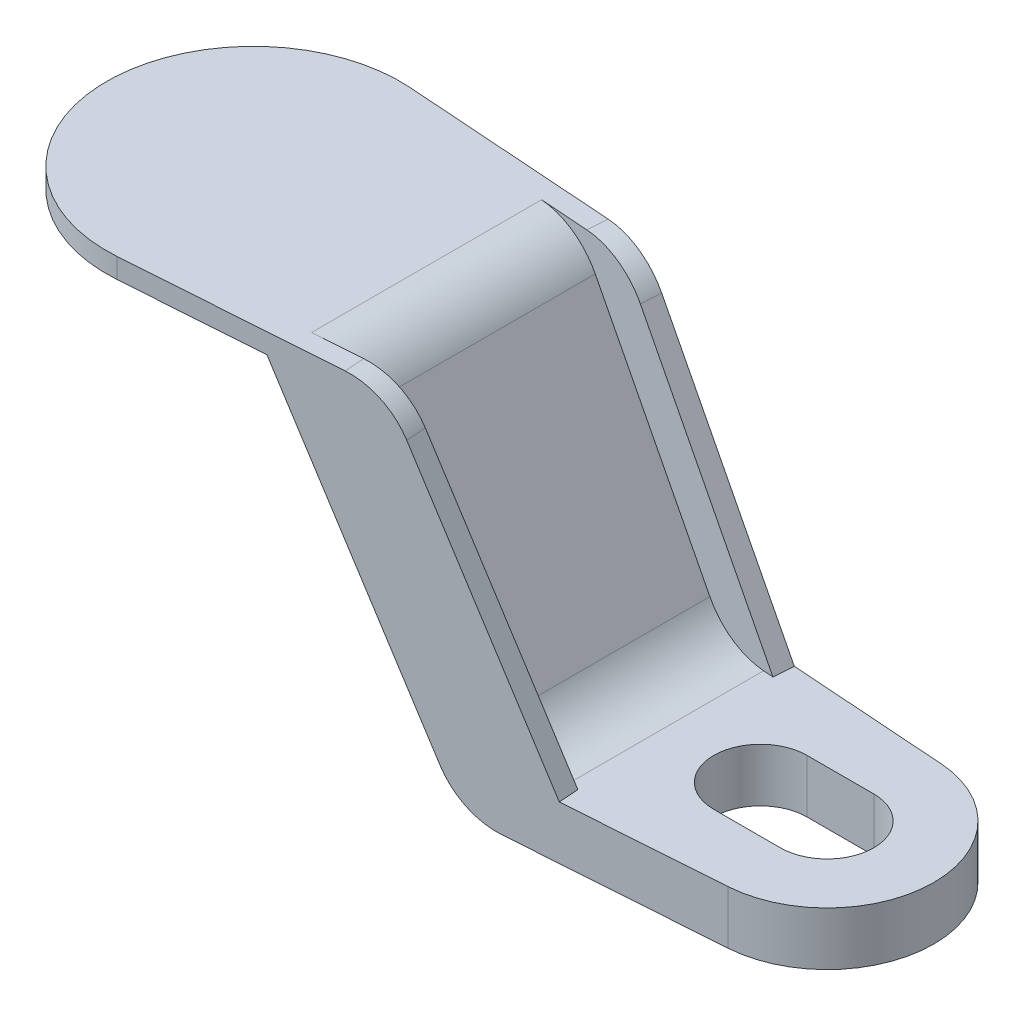
ISO-10303-21;
HEADER;
FILE_DESCRIPTION(('STEP AP214'),'2;1');
FILE_NAME('part.step','',(''),(''),'','','');
FILE_SCHEMA(('AUTOMOTIVE_DESIGN { 1 0 10303 214 1 1 1 1 }'));
ENDSEC;
DATA;
#1=APPLICATION_CONTEXT('core data for automotive mechanical design processes');
#2=APPLICATION_PROTOCOL_DEFINITION('international standard','automotive_design',2000,#1);
#3=PRODUCT_CONTEXT('',#1,'mechanical');
#4=PRODUCT('Part','Part','',(#3));
#5=PRODUCT_RELATED_PRODUCT_CATEGORY('part','',(#4));
#6=PRODUCT_DEFINITION_FORMATION('','',#4);
#7=PRODUCT_DEFINITION_CONTEXT('part definition',#1,'design');
#8=PRODUCT_DEFINITION('design','',#6,#7);
#9=PRODUCT_DEFINITION_SHAPE('','',#8);
#10=(LENGTH_UNIT() NAMED_UNIT(*) SI_UNIT(.MILLI.,.METRE.));
#11=(NAMED_UNIT(*) PLANE_ANGLE_UNIT() SI_UNIT($,.RADIAN.));
#12=(NAMED_UNIT(*) SI_UNIT($,.STERADIAN.) SOLID_ANGLE_UNIT());
#13=UNCERTAINTY_MEASURE_WITH_UNIT(LENGTH_MEASURE(1.E-05),#10,'distance_accuracy_value','');
#14=(GEOMETRIC_REPRESENTATION_CONTEXT(3) GLOBAL_UNCERTAINTY_ASSIGNED_CONTEXT((#13)) GLOBAL_UNIT_ASSIGNED_CONTEXT((#10,
#11,#12)) REPRESENTATION_CONTEXT('',''));
#15=CARTESIAN_POINT('',(0.,0.,0.));
#16=DIRECTION('',(0.,0.,1.));
#17=DIRECTION('',(1.,0.,0.));
#18=AXIS2_PLACEMENT_3D('',#15,#16,#17);
#19=CARTESIAN_POINT('',(28.5677313259564,0.,-11.));
#20=DIRECTION('',(0.866025403784436,0.500000000000004,0.));
#21=DIRECTION('',(-0.500000000000004,0.866025403784436,0.));
#22=AXIS2_PLACEMENT_3D('',#19,#20,#21);
#23=PLANE('',#22);
#24=DIRECTION('',(-0.4996945735623,0.865496389676358,-0.0349475694373828));
#25=VECTOR('',#24,1.);
#26=CARTESIAN_POINT('',(28.5070511955666,0.105101068845031,-7.52948318100781));
#27=LINE('',#26,#25);
#28=CARTESIAN_POINT('',(27.1243556529823,2.49999999999998,-7.62618594914223));
#29=VERTEX_POINT('',#28);
#30=CARTESIAN_POINT('',(16.4433756729741,21.,-8.37319083824795));
#31=VERTEX_POINT('',#30);
#32=EDGE_CURVE('E229',#29,#31,#27,.T.);
#33=ORIENTED_EDGE('',*,*,#32,.F.);
#34=DIRECTION('',(0.,0.,1.));
#35=VECTOR('',#34,1.);
#36=CARTESIAN_POINT('',(27.1243556529823,2.49999999999998,-11.));
#37=LINE('',#36,#35);
#38=CARTESIAN_POINT('',(27.1243556529823,2.49999999999998,7.62618594914224));
#39=VERTEX_POINT('',#38);
#40=EDGE_CURVE('E248',#29,#39,#37,.T.);
#41=ORIENTED_EDGE('',*,*,#40,.T.);
#42=DIRECTION('',(0.4996945735623,-0.865496389676358,-0.0349475694373828));
#43=VECTOR('',#42,1.);
#44=CARTESIAN_POINT('',(28.8912396333217,-0.56033282502738,7.50261386359704));
#45=LINE('',#44,#43);
#46=CARTESIAN_POINT('',(16.4433756729741,21.,8.37319083824795));
#47=VERTEX_POINT('',#46);
#48=EDGE_CURVE('E376',#47,#39,#45,.T.);
#49=ORIENTED_EDGE('',*,*,#48,.F.);
#50=DIRECTION('',(0.,0.,1.));
#51=VECTOR('',#50,1.);
#52=CARTESIAN_POINT('',(16.4433756729741,21.,-8.47413744488385));
#53=LINE('',#52,#51);
#54=EDGE_CURVE('E245',#47,#31,#53,.F.);
#55=ORIENTED_EDGE('',*,*,#54,.T.);
#56=EDGE_LOOP('',(#33,#41,#49,#55));
#57=FACE_BOUND('',#56,.T.);
#58=ADVANCED_FACE('F33',(#57),#23,.F.);
#59=CARTESIAN_POINT('',(15.8660254037844,25.,-11.));
#60=DIRECTION('',(-0.866025403784436,-0.500000000000004,0.));
#61=DIRECTION('',(0.500000000000004,-0.866025403784436,0.));
#62=AXIS2_PLACEMENT_3D('',#59,#60,#61);
#63=PLANE('',#62);
#64=DIRECTION('',(-0.4996945735623,0.865496389676358,0.0349475694373828));
#65=VECTOR('',#64,1.);
#66=CARTESIAN_POINT('',(16.2050467187898,24.4127978575618,8.38985905542693));
#67=LINE('',#66,#65);
#68=CARTESIAN_POINT('',(26.5470053837926,6.49999999999998,7.6665645917966));
#69=VERTEX_POINT('',#68);
#70=CARTESIAN_POINT('',(17.3094010767585,22.5,8.31262287426641));
#71=VERTEX_POINT('',#70);
#72=EDGE_CURVE('E325',#69,#71,#67,.T.);
#73=ORIENTED_EDGE('',*,*,#72,.F.);
#74=DIRECTION('',(0.,0.,1.));
#75=VECTOR('',#74,1.);
#76=CARTESIAN_POINT('',(26.5470053837926,6.49999999999998,-7.56561798516069));
#77=LINE('',#76,#75);
#78=CARTESIAN_POINT('',(26.5470053837926,6.49999999999998,-7.6665645917966));
#79=VERTEX_POINT('',#78);
#80=EDGE_CURVE('E296',#69,#79,#77,.F.);
#81=ORIENTED_EDGE('',*,*,#80,.T.);
#82=DIRECTION('',(0.4996945735623,-0.865496389676358,0.0349475694373828));
#83=VECTOR('',#82,1.);
#84=CARTESIAN_POINT('',(15.8208582810347,25.0782317514343,-8.4167283728377));
#85=LINE('',#84,#83);
#86=CARTESIAN_POINT('',(17.3094010767585,22.5,-8.3126228742664));
#87=VERTEX_POINT('',#86);
#88=EDGE_CURVE('E230',#87,#79,#85,.T.);
#89=ORIENTED_EDGE('',*,*,#88,.F.);
#90=DIRECTION('',(0.,0.,1.));
#91=VECTOR('',#90,1.);
#92=CARTESIAN_POINT('',(17.3094010767585,22.5,8.41356948090231));
#93=LINE('',#92,#91);
#94=EDGE_CURVE('E293',#87,#71,#93,.T.);
#95=ORIENTED_EDGE('',*,*,#94,.T.);
#96=EDGE_LOOP('',(#73,#81,#89,#95));
#97=FACE_BOUND('',#96,.T.);
#98=ADVANCED_FACE('F522',(#97),#63,.F.);
#99=CARTESIAN_POINT('',(-11.,23.5,-11.));
#100=DIRECTION('',(0.,1.,0.));
#101=DIRECTION('',(0.,0.,1.));
#102=AXIS2_PLACEMENT_3D('',#99,#100,#101);
#103=PLANE('',#102);
#104=DIRECTION('',(-0.997563283233824,0.,-0.069767441860465));
#105=VECTOR('',#104,1.);
#106=CARTESIAN_POINT('',(-11.0492386689609,23.5,-10.2959654681193));
#107=LINE('',#106,#105);
#108=CARTESIAN_POINT('',(12.1132486540519,23.5,-8.67603065815566));
#109=VERTEX_POINT('',#108);
#110=CARTESIAN_POINT('',(11.1510105462042,23.5,-8.74332753282367));
#111=VERTEX_POINT('',#110);
#112=EDGE_CURVE('E217',#109,#111,#107,.T.);
#113=ORIENTED_EDGE('',*,*,#112,.F.);
#114=DIRECTION('',(0.,0.,1.));
#115=VECTOR('',#114,1.);
#116=CARTESIAN_POINT('',(12.1132486540519,23.5,8.47413744488385));
#117=LINE('',#116,#115);
#118=CARTESIAN_POINT('',(12.1132486540519,23.5,8.67603065815567));
#119=VERTEX_POINT('',#118);
#120=EDGE_CURVE('E265',#109,#119,#117,.T.);
#121=ORIENTED_EDGE('',*,*,#120,.T.);
#122=DIRECTION('',(0.997563283233824,0.,-0.069767441860465));
#123=VECTOR('',#122,1.);
#124=CARTESIAN_POINT('',(-9.51809502492764,23.5,10.1888805573567));
#125=LINE('',#124,#123);
#126=CARTESIAN_POINT('',(11.1510105462042,23.5,8.74332753282367));
#127=VERTEX_POINT('',#126);
#128=EDGE_CURVE('E379',#127,#119,#125,.T.);
#129=ORIENTED_EDGE('',*,*,#128,.F.);
#130=DIRECTION('',(0.0697674418604651,0.,0.997563283233824));
#131=VECTOR('',#130,1.);
#132=CARTESIAN_POINT('',(9.66910557113185,23.5,-12.445553024533));
#133=LINE('',#132,#131);
#134=CARTESIAN_POINT('',(11.2556617089949,23.5,10.2396724576744));
#135=VERTEX_POINT('',#134);
#136=EDGE_CURVE('E454',#127,#135,#133,.T.);
#137=ORIENTED_EDGE('',*,*,#136,.T.);
#138=DIRECTION('',(0.997563283233824,0.,-0.0697674418604651));
#139=VECTOR('',#138,1.);
#140=CARTESIAN_POINT('',(0.767441860465116,23.5,10.9731961155721));
#141=LINE('',#140,#139);
#142=CARTESIAN_POINT('',(0.767441860465116,23.5,10.9731961155721));
#143=VERTEX_POINT('',#142);
#144=EDGE_CURVE('E399',#143,#135,#141,.T.);
#145=ORIENTED_EDGE('',*,*,#144,.F.);
#146=CARTESIAN_POINT('',(0.,23.5,0.));
#147=DIRECTION('',(0.,1.,0.));
#148=DIRECTION('',(0.,0.,1.));
#149=AXIS2_PLACEMENT_3D('',#146,#147,#148);
#150=CIRCLE('',#149,11.);
#151=CARTESIAN_POINT('',(0.767441860465116,23.5,-10.9731961155721));
#152=VERTEX_POINT('',#151);
#153=EDGE_CURVE('E396',#152,#143,#150,.T.);
#154=ORIENTED_EDGE('',*,*,#153,.F.);
#155=DIRECTION('',(-0.997563283233824,0.,-0.0697674418604651));
#156=VECTOR('',#155,1.);
#157=CARTESIAN_POINT('',(0.767441860465116,23.5,-10.9731961155721));
#158=LINE('',#157,#156);
#159=CARTESIAN_POINT('',(11.2556617089949,23.5,-10.2396724576744));
#160=VERTEX_POINT('',#159);
#161=EDGE_CURVE('E244',#160,#152,#158,.T.);
#162=ORIENTED_EDGE('',*,*,#161,.F.);
#163=DIRECTION('',(0.0697674418604651,0.,-0.997563283233824));
#164=VECTOR('',#163,1.);
#165=CARTESIAN_POINT('',(11.2002492151652,23.5,-9.44736206470439));
#166=LINE('',#165,#164);
#167=EDGE_CURVE('E236',#111,#160,#166,.T.);
#168=ORIENTED_EDGE('',*,*,#167,.F.);
#169=EDGE_LOOP('',(#113,#121,#129,#137,#145,#154,#162,#168));
#170=FACE_BOUND('',#169,.T.);
#171=ADVANCED_FACE('F242',(#170),#103,.F.);
#172=CARTESIAN_POINT('',(51.,4.,-11.));
#173=DIRECTION('',(0.,-1.,0.));
#174=DIRECTION('',(1.,0.,0.));
#175=AXIS2_PLACEMENT_3D('',#172,#173,#174);
#176=PLANE('',#175);
#177=CARTESIAN_POINT('',(43.,4.,0.));
#178=DIRECTION('',(0.,-1.,0.));
#179=DIRECTION('',(1.,0.,0.));
#180=AXIS2_PLACEMENT_3D('',#177,#178,#179);
#181=CIRCLE('',#180,3.5);
#182=CARTESIAN_POINT('',(43.,4.,-3.5));
#183=VERTEX_POINT('',#182);
#184=CARTESIAN_POINT('',(43.,4.,3.5));
#185=VERTEX_POINT('',#184);
#186=EDGE_CURVE('E386',#183,#185,#181,.T.);
#187=ORIENTED_EDGE('',*,*,#186,.T.);
#188=DIRECTION('',(-1.,0.,0.));
#189=VECTOR('',#188,1.);
#190=CARTESIAN_POINT('',(43.,4.,3.5));
#191=LINE('',#190,#189);
#192=CARTESIAN_POINT('',(38.,4.,3.5));
#193=VERTEX_POINT('',#192);
#194=EDGE_CURVE('E447',#185,#193,#191,.T.);
#195=ORIENTED_EDGE('',*,*,#194,.T.);
#196=CARTESIAN_POINT('',(38.,4.,0.));
#197=DIRECTION('',(0.,-1.,0.));
#198=DIRECTION('',(1.,0.,0.));
#199=AXIS2_PLACEMENT_3D('',#196,#197,#198);
#200=CIRCLE('',#199,3.5);
#201=CARTESIAN_POINT('',(38.,4.,-3.5));
#202=VERTEX_POINT('',#201);
#203=EDGE_CURVE('E382',#193,#202,#200,.T.);
#204=ORIENTED_EDGE('',*,*,#203,.T.);
#205=DIRECTION('',(1.,0.,0.));
#206=VECTOR('',#205,1.);
#207=CARTESIAN_POINT('',(43.,4.,-3.5));
#208=LINE('',#207,#206);
#209=EDGE_CURVE('E384',#202,#183,#208,.T.);
#210=ORIENTED_EDGE('',*,*,#209,.T.);
#211=EDGE_LOOP('',(#187,#195,#204,#210));
#212=FACE_BOUND('',#211,.T.);
#213=DIRECTION('',(0.997563283233824,0.,0.069767441860465));
#214=VECTOR('',#213,1.);
#215=CARTESIAN_POINT('',(50.6489765825263,4.,-5.98092428947994));
#216=LINE('',#215,#214);
#217=CARTESIAN_POINT('',(30.8771324027148,4.,-7.36372477188888));
#218=VERTEX_POINT('',#217);
#219=CARTESIAN_POINT('',(31.6300681849811,4.,-7.31106605409442));
#220=VERTEX_POINT('',#219);
#221=EDGE_CURVE('E251',#218,#220,#216,.T.);
#222=ORIENTED_EDGE('',*,*,#221,.F.);
#223=DIRECTION('',(0.,0.,1.));
#224=VECTOR('',#223,1.);
#225=CARTESIAN_POINT('',(30.8771324027148,4.,7.56561798516069));
#226=LINE('',#225,#224);
#227=CARTESIAN_POINT('',(30.8771324027148,4.,7.36372477188888));
#228=VERTEX_POINT('',#227);
#229=EDGE_CURVE('E286',#218,#228,#226,.T.);
#230=ORIENTED_EDGE('',*,*,#229,.T.);
#231=DIRECTION('',(-0.997563283233824,0.,0.069767441860465));
#232=VECTOR('',#231,1.);
#233=CARTESIAN_POINT('',(52.1801202265597,4.,5.87383937871737));
#234=LINE('',#233,#232);
#235=CARTESIAN_POINT('',(31.6300681849811,4.,7.31106605409442));
#236=VERTEX_POINT('',#235);
#237=EDGE_CURVE('E449',#236,#228,#234,.T.);
#238=ORIENTED_EDGE('',*,*,#237,.F.);
#239=DIRECTION('',(0.0697674418604651,0.,0.997563283233824));
#240=VECTOR('',#239,1.);
#241=CARTESIAN_POINT('',(30.4499479584214,4.,-9.56277332462295));
#242=LINE('',#241,#240);
#243=CARTESIAN_POINT('',(31.7347193477718,4.,8.80741097894516));
#244=VERTEX_POINT('',#243);
#245=EDGE_CURVE('E451',#236,#244,#242,.T.);
#246=ORIENTED_EDGE('',*,*,#245,.T.);
#247=DIRECTION('',(-0.997563283233824,0.,0.0697674418604651));
#248=VECTOR('',#247,1.);
#249=CARTESIAN_POINT('',(0.767441860465119,3.99999999999999,10.9731961155721));
#250=LINE('',#249,#248);
#251=CARTESIAN_POINT('',(43.5581395348837,4.,7.98050626587059));
#252=VERTEX_POINT('',#251);
#253=EDGE_CURVE('E393',#252,#244,#250,.T.);
#254=ORIENTED_EDGE('',*,*,#253,.F.);
#255=CARTESIAN_POINT('',(43.,4.,0.));
#256=DIRECTION('',(0.,-1.,0.));
#257=DIRECTION('',(1.,0.,0.));
#258=AXIS2_PLACEMENT_3D('',#255,#256,#257);
#259=CIRCLE('',#258,8.);
#260=CARTESIAN_POINT('',(43.5581395348837,4.,-7.98050626587059));
#261=VERTEX_POINT('',#260);
#262=EDGE_CURVE('E390',#261,#252,#259,.T.);
#263=ORIENTED_EDGE('',*,*,#262,.F.);
#264=DIRECTION('',(0.997563283233824,0.,0.0697674418604651));
#265=VECTOR('',#264,1.);
#266=CARTESIAN_POINT('',(0.767441860465119,3.99999999999999,-10.9731961155721));
#267=LINE('',#266,#265);
#268=CARTESIAN_POINT('',(31.7347193477718,4.,-8.80741097894515));
#269=VERTEX_POINT('',#268);
#270=EDGE_CURVE('E388',#269,#261,#267,.T.);
#271=ORIENTED_EDGE('',*,*,#270,.F.);
#272=DIRECTION('',(0.0697674418604651,0.,-0.997563283233824));
#273=VECTOR('',#272,1.);
#274=CARTESIAN_POINT('',(31.9810916024548,4.,-12.3301417646145));
#275=LINE('',#274,#273);
#276=EDGE_CURVE('E246',#220,#269,#275,.T.);
#277=ORIENTED_EDGE('',*,*,#276,.F.);
#278=EDGE_LOOP('',(#222,#230,#238,#246,#254,#263,#271,#277));
#279=FACE_BOUND('',#278,.T.);
#280=ADVANCED_FACE('F462',(#212,#279),#176,.F.);
#281=CARTESIAN_POINT('',(0.,25.,0.));
#282=DIRECTION('',(0.,1.,0.));
#283=DIRECTION('',(0.,0.,1.));
#284=AXIS2_PLACEMENT_3D('',#281,#282,#283);
#285=PLANE('',#284);
#286=DIRECTION('',(0.997563283233824,0.,-0.0697674418604651));
#287=VECTOR('',#286,1.);
#288=CARTESIAN_POINT('',(0.767441860465116,25.,10.9731961155721));
#289=LINE('',#288,#287);
#290=CARTESIAN_POINT('',(0.767441860465116,25.,10.9731961155721));
#291=VERTEX_POINT('',#290);
#292=CARTESIAN_POINT('',(16.7341604222508,25.,9.85651797827069));
#293=VERTEX_POINT('',#292);
#294=EDGE_CURVE('E426',#291,#293,#289,.T.);
#295=ORIENTED_EDGE('',*,*,#294,.T.);
#296=DIRECTION('',(0.0697674418604651,0.,0.997563283233824));
#297=VECTOR('',#296,1.);
#298=CARTESIAN_POINT('',(15.9667185617856,25.,-1.11667813730137));
#299=LINE('',#298,#297);
#300=CARTESIAN_POINT('',(16.6295092594601,25.,8.36017305341996));
#301=VERTEX_POINT('',#300);
#302=EDGE_CURVE('E310',#293,#301,#299,.F.);
#303=ORIENTED_EDGE('',*,*,#302,.T.);
#304=DIRECTION('',(-0.997563283233824,0.,0.069767441860465));
#305=VECTOR('',#304,1.);
#306=CARTESIAN_POINT('',(10.2849851424198,25.,8.80389549680521));
#307=LINE('',#306,#305);
#308=CARTESIAN_POINT('',(12.9792740578363,25.,8.61546269417412));
#309=VERTEX_POINT('',#308);
#310=EDGE_CURVE('E48',#301,#309,#307,.T.);
#311=ORIENTED_EDGE('',*,*,#310,.T.);
#312=DIRECTION('',(0.,0.,1.));
#313=VECTOR('',#312,1.);
#314=CARTESIAN_POINT('',(12.9792740578363,25.,-8.41356948090231));
#315=LINE('',#314,#313);
#316=CARTESIAN_POINT('',(12.9792740578363,25.,-8.61546269417412));
#317=VERTEX_POINT('',#316);
#318=EDGE_CURVE('E305',#309,#317,#315,.F.);
#319=ORIENTED_EDGE('',*,*,#318,.T.);
#320=DIRECTION('',(-0.997563283233824,0.,-0.069767441860465));
#321=VECTOR('',#320,1.);
#322=CARTESIAN_POINT('',(10.2849851424198,25.,-8.80389549680521));
#323=LINE('',#322,#321);
#324=CARTESIAN_POINT('',(16.6295092594601,25.,-8.36017305341996));
#325=VERTEX_POINT('',#324);
#326=EDGE_CURVE('E55',#325,#317,#323,.T.);
#327=ORIENTED_EDGE('',*,*,#326,.F.);
#328=DIRECTION('',(0.0697674418604651,0.,-0.997563283233824));
#329=VECTOR('',#328,1.);
#330=CARTESIAN_POINT('',(16.7341604222508,25.,-9.85651797827069));
#331=LINE('',#330,#329);
#332=CARTESIAN_POINT('',(16.7341604222508,25.,-9.85651797827069));
#333=VERTEX_POINT('',#332);
#334=EDGE_CURVE('E307',#325,#333,#331,.T.);
#335=ORIENTED_EDGE('',*,*,#334,.T.);
#336=DIRECTION('',(-0.997563283233824,0.,-0.0697674418604651));
#337=VECTOR('',#336,1.);
#338=CARTESIAN_POINT('',(0.767441860465116,25.,-10.9731961155721));
#339=LINE('',#338,#337);
#340=CARTESIAN_POINT('',(0.767441860465116,25.,-10.9731961155721));
#341=VERTEX_POINT('',#340);
#342=EDGE_CURVE('E344',#333,#341,#339,.T.);
#343=ORIENTED_EDGE('',*,*,#342,.T.);
#344=CARTESIAN_POINT('',(0.,25.,0.));
#345=DIRECTION('',(0.,1.,0.));
#346=DIRECTION('',(0.,0.,1.));
#347=AXIS2_PLACEMENT_3D('',#344,#345,#346);
#348=CIRCLE('',#347,11.);
#349=EDGE_CURVE('E423',#341,#291,#348,.T.);
#350=ORIENTED_EDGE('',*,*,#349,.T.);
#351=EDGE_LOOP('',(#295,#303,#311,#319,#327,#335,#343,#350));
#352=FACE_BOUND('',#351,.T.);
#353=ADVANCED_FACE('F330',(#352),#285,.T.);
#354=CARTESIAN_POINT('',(0.,0.,0.));
#355=DIRECTION('',(0.,1.,0.));
#356=DIRECTION('',(0.,0.,1.));
#357=AXIS2_PLACEMENT_3D('',#354,#355,#356);
#358=PLANE('',#357);
#359=DIRECTION('',(0.997563283233824,0.,-0.069767441860465));
#360=VECTOR('',#359,1.);
#361=CARTESIAN_POINT('',(24.7187418721606,0.,7.79442943044614));
#362=LINE('',#361,#360);
#363=CARTESIAN_POINT('',(27.5949451446993,0.,7.59327392686222));
#364=VERTEX_POINT('',#363);
#365=CARTESIAN_POINT('',(31.4544826719045,0.,7.32334612923452));
#366=VERTEX_POINT('',#365);
#367=EDGE_CURVE('E364',#364,#366,#362,.T.);
#368=ORIENTED_EDGE('',*,*,#367,.T.);
#369=DIRECTION('',(0.,0.,1.));
#370=VECTOR('',#369,1.);
#371=CARTESIAN_POINT('',(31.4544826719045,0.,0.));
#372=LINE('',#371,#370);
#373=CARTESIAN_POINT('',(31.4544826719045,0.,-7.32334612923452));
#374=VERTEX_POINT('',#373);
#375=EDGE_CURVE('E262',#366,#374,#372,.F.);
#376=ORIENTED_EDGE('',*,*,#375,.T.);
#377=DIRECTION('',(0.997563283233824,0.,0.069767441860465));
#378=VECTOR('',#377,1.);
#379=CARTESIAN_POINT('',(24.7187418721606,0.,-7.79442943044614));
#380=LINE('',#379,#378);
#381=CARTESIAN_POINT('',(27.5949451446993,0.,-7.59327392686222));
#382=VERTEX_POINT('',#381);
#383=EDGE_CURVE('E357',#382,#374,#380,.T.);
#384=ORIENTED_EDGE('',*,*,#383,.F.);
#385=DIRECTION('',(0.0697674418604651,0.,-0.997563283233824));
#386=VECTOR('',#385,1.);
#387=CARTESIAN_POINT('',(26.9321544470249,0.,1.88357726385911));
#388=LINE('',#387,#386);
#389=CARTESIAN_POINT('',(27.69959630749,0.,-9.08961885171295));
#390=VERTEX_POINT('',#389);
#391=EDGE_CURVE('E259',#382,#390,#388,.T.);
#392=ORIENTED_EDGE('',*,*,#391,.T.);
#393=DIRECTION('',(-0.997563283233824,0.,-0.0697674418604651));
#394=VECTOR('',#393,1.);
#395=CARTESIAN_POINT('',(0.767441860465116,0.,-10.9731961155721));
#396=LINE('',#395,#394);
#397=CARTESIAN_POINT('',(43.5581395348837,0.,-7.98050626587059));
#398=VERTEX_POINT('',#397);
#399=EDGE_CURVE('E427',#398,#390,#396,.T.);
#400=ORIENTED_EDGE('',*,*,#399,.F.);
#401=CARTESIAN_POINT('',(43.,0.,0.));
#402=DIRECTION('',(0.,1.,0.));
#403=DIRECTION('',(0.,0.,1.));
#404=AXIS2_PLACEMENT_3D('',#401,#402,#403);
#405=CIRCLE('',#404,8.);
#406=CARTESIAN_POINT('',(43.5581395348837,0.,7.98050626587059));
#407=VERTEX_POINT('',#406);
#408=EDGE_CURVE('E432',#407,#398,#405,.T.);
#409=ORIENTED_EDGE('',*,*,#408,.F.);
#410=DIRECTION('',(0.997563283233824,0.,-0.0697674418604651));
#411=VECTOR('',#410,1.);
#412=CARTESIAN_POINT('',(0.767441860465116,0.,10.9731961155721));
#413=LINE('',#412,#411);
#414=CARTESIAN_POINT('',(27.69959630749,0.,9.08961885171295));
#415=VERTEX_POINT('',#414);
#416=EDGE_CURVE('E422',#415,#407,#413,.T.);
#417=ORIENTED_EDGE('',*,*,#416,.F.);
#418=DIRECTION('',(0.0697674418604651,0.,0.997563283233824));
#419=VECTOR('',#418,1.);
#420=CARTESIAN_POINT('',(27.5949451446993,0.,7.59327392686222));
#421=LINE('',#420,#419);
#422=EDGE_CURVE('E257',#415,#364,#421,.F.);
#423=ORIENTED_EDGE('',*,*,#422,.T.);
#424=EDGE_LOOP('',(#368,#376,#384,#392,#400,#409,#417,#423));
#425=FACE_BOUND('',#424,.T.);
#426=CARTESIAN_POINT('',(43.,0.,0.));
#427=DIRECTION('',(0.,1.,0.));
#428=DIRECTION('',(0.,0.,1.));
#429=AXIS2_PLACEMENT_3D('',#426,#427,#428);
#430=CIRCLE('',#429,3.5);
#431=CARTESIAN_POINT('',(43.,0.,3.5));
#432=VERTEX_POINT('',#431);
#433=CARTESIAN_POINT('',(43.,0.,-3.5));
#434=VERTEX_POINT('',#433);
#435=EDGE_CURVE('E402',#432,#434,#430,.T.);
#436=ORIENTED_EDGE('',*,*,#435,.T.);
#437=DIRECTION('',(-1.,0.,0.));
#438=VECTOR('',#437,1.);
#439=CARTESIAN_POINT('',(43.,0.,-3.5));
#440=LINE('',#439,#438);
#441=CARTESIAN_POINT('',(38.,0.,-3.5));
#442=VERTEX_POINT('',#441);
#443=EDGE_CURVE('E405',#434,#442,#440,.T.);
#444=ORIENTED_EDGE('',*,*,#443,.T.);
#445=CARTESIAN_POINT('',(38.,0.,0.));
#446=DIRECTION('',(0.,1.,0.));
#447=DIRECTION('',(0.,0.,1.));
#448=AXIS2_PLACEMENT_3D('',#445,#446,#447);
#449=CIRCLE('',#448,3.5);
#450=CARTESIAN_POINT('',(38.,0.,3.5));
#451=VERTEX_POINT('',#450);
#452=EDGE_CURVE('E408',#442,#451,#449,.T.);
#453=ORIENTED_EDGE('',*,*,#452,.T.);
#454=DIRECTION('',(1.,0.,0.));
#455=VECTOR('',#454,1.);
#456=CARTESIAN_POINT('',(43.,0.,3.5));
#457=LINE('',#456,#455);
#458=EDGE_CURVE('E411',#451,#432,#457,.T.);
#459=ORIENTED_EDGE('',*,*,#458,.T.);
#460=EDGE_LOOP('',(#436,#444,#453,#459));
#461=FACE_BOUND('',#460,.T.);
#462=ADVANCED_FACE('F472',(#425,#461),#358,.F.);
#463=CARTESIAN_POINT('',(0.,25.,0.));
#464=DIRECTION('',(0.,-1.,0.));
#465=DIRECTION('',(0.,0.,-1.));
#466=AXIS2_PLACEMENT_3D('',#463,#464,#465);
#467=CYLINDRICAL_SURFACE('',#466,11.);
#468=DIRECTION('',(0.,-1.,0.));
#469=VECTOR('',#468,1.);
#470=CARTESIAN_POINT('',(0.767441860465116,25.,-10.9731961155721));
#471=LINE('',#470,#469);
#472=EDGE_CURVE('E430',#341,#152,#471,.T.);
#473=ORIENTED_EDGE('',*,*,#472,.T.);
#474=ORIENTED_EDGE('',*,*,#153,.T.);
#475=DIRECTION('',(0.,-1.,0.));
#476=VECTOR('',#475,1.);
#477=CARTESIAN_POINT('',(0.767441860465116,25.,10.9731961155721));
#478=LINE('',#477,#476);
#479=EDGE_CURVE('E443',#291,#143,#478,.T.);
#480=ORIENTED_EDGE('',*,*,#479,.F.);
#481=ORIENTED_EDGE('',*,*,#349,.F.);
#482=EDGE_LOOP('',(#473,#474,#480,#481));
#483=FACE_BOUND('',#482,.T.);
#484=ADVANCED_FACE('F481',(#483),#467,.T.);
#485=CARTESIAN_POINT('',(0.767441860465116,25.,10.9731961155721));
#486=DIRECTION('',(-0.0697674418604651,0.,-0.997563283233824));
#487=DIRECTION('',(-0.997563283233824,0.,0.0697674418604651));
#488=AXIS2_PLACEMENT_3D('',#485,#486,#487);
#489=PLANE('',#488);
#490=DIRECTION('',(0.4996945735623,-0.865496389676358,-0.0349475694373828));
#491=VECTOR('',#490,1.);
#492=CARTESIAN_POINT('',(10.3896363052105,25.,10.3002404216559));
#493=LINE('',#492,#491);
#494=CARTESIAN_POINT('',(23.3826592069272,2.4954241903209,9.3915361969489));
#495=VERTEX_POINT('',#494);
#496=EDGE_CURVE('E360',#135,#495,#493,.T.);
#497=ORIENTED_EDGE('',*,*,#496,.T.);
#498=CARTESIAN_POINT('',(27.69959630749,5.,9.08961885171295));
#499=DIRECTION('',(-0.0697674418604651,0.,-0.997563283233824));
#500=DIRECTION('',(-0.997563283233824,0.,0.0697674418604651));
#501=AXIS2_PLACEMENT_3D('',#498,#499,#500);
#502=CIRCLE('',#501,5.);
#503=EDGE_CURVE('E284',#495,#415,#502,.F.);
#504=ORIENTED_EDGE('',*,*,#503,.T.);
#505=ORIENTED_EDGE('',*,*,#416,.T.);
#506=DIRECTION('',(0.,-1.,0.));
#507=VECTOR('',#506,1.);
#508=CARTESIAN_POINT('',(43.5581395348837,25.,7.98050626587059));
#509=LINE('',#508,#507);
#510=EDGE_CURVE('E440',#252,#407,#509,.T.);
#511=ORIENTED_EDGE('',*,*,#510,.F.);
#512=ORIENTED_EDGE('',*,*,#253,.T.);
#513=DIRECTION('',(-0.4996945735623,0.865496389676358,0.0349475694373828));
#514=VECTOR('',#513,1.);
#515=CARTESIAN_POINT('',(19.6103636947895,25.,9.65536247468678));
#516=LINE('',#515,#514);
#517=CARTESIAN_POINT('',(21.0510975228136,22.5045758096791,9.55460063303475));
#518=VERTEX_POINT('',#517);
#519=EDGE_CURVE('E365',#244,#518,#516,.T.);
#520=ORIENTED_EDGE('',*,*,#519,.T.);
#521=CARTESIAN_POINT('',(16.7341604222508,20.,9.85651797827069));
#522=DIRECTION('',(-0.0697674418604651,0.,-0.997563283233824));
#523=DIRECTION('',(-0.997563283233824,0.,0.0697674418604651));
#524=AXIS2_PLACEMENT_3D('',#521,#522,#523);
#525=CIRCLE('',#524,5.);
#526=EDGE_CURVE('E282',#518,#293,#525,.F.);
#527=ORIENTED_EDGE('',*,*,#526,.T.);
#528=ORIENTED_EDGE('',*,*,#294,.F.);
#529=ORIENTED_EDGE('',*,*,#479,.T.);
#530=ORIENTED_EDGE('',*,*,#144,.T.);
#531=EDGE_LOOP('',(#497,#504,#505,#511,#512,#520,#527,#528,#529,#530));
#532=FACE_BOUND('',#531,.T.);
#533=ADVANCED_FACE('F491',(#532),#489,.F.);
#534=CARTESIAN_POINT('',(43.,25.,0.));
#535=DIRECTION('',(0.,-1.,0.));
#536=DIRECTION('',(0.,0.,-1.));
#537=AXIS2_PLACEMENT_3D('',#534,#535,#536);
#538=CYLINDRICAL_SURFACE('',#537,8.);
#539=DIRECTION('',(0.,-1.,0.));
#540=VECTOR('',#539,1.);
#541=CARTESIAN_POINT('',(43.5581395348837,25.,-7.98050626587059));
#542=LINE('',#541,#540);
#543=EDGE_CURVE('E438',#261,#398,#542,.T.);
#544=ORIENTED_EDGE('',*,*,#543,.F.);
#545=ORIENTED_EDGE('',*,*,#262,.T.);
#546=ORIENTED_EDGE('',*,*,#510,.T.);
#547=ORIENTED_EDGE('',*,*,#408,.T.);
#548=EDGE_LOOP('',(#544,#545,#546,#547));
#549=FACE_BOUND('',#548,.T.);
#550=ADVANCED_FACE('F468',(#549),#538,.T.);
#551=CARTESIAN_POINT('',(0.767441860465116,25.,-10.9731961155721));
#552=DIRECTION('',(-0.0697674418604651,0.,0.997563283233824));
#553=DIRECTION('',(0.997563283233824,0.,0.0697674418604651));
#554=AXIS2_PLACEMENT_3D('',#551,#552,#553);
#555=PLANE('',#554);
#556=ORIENTED_EDGE('',*,*,#399,.T.);
#557=CARTESIAN_POINT('',(27.69959630749,5.,-9.08961885171295));
#558=DIRECTION('',(-0.0697674418604651,0.,0.997563283233824));
#559=DIRECTION('',(0.997563283233824,0.,0.0697674418604651));
#560=AXIS2_PLACEMENT_3D('',#557,#558,#559);
#561=CIRCLE('',#560,5.);
#562=CARTESIAN_POINT('',(23.3826592069272,2.4954241903209,-9.3915361969489));
#563=VERTEX_POINT('',#562);
#564=EDGE_CURVE('E276',#390,#563,#561,.F.);
#565=ORIENTED_EDGE('',*,*,#564,.T.);
#566=DIRECTION('',(0.4996945735623,-0.865496389676358,0.0349475694373828));
#567=VECTOR('',#566,1.);
#568=CARTESIAN_POINT('',(10.3896363052105,25.,-10.3002404216559));
#569=LINE('',#568,#567);
#570=EDGE_CURVE('E351',#160,#563,#569,.T.);
#571=ORIENTED_EDGE('',*,*,#570,.F.);
#572=ORIENTED_EDGE('',*,*,#161,.T.);
#573=ORIENTED_EDGE('',*,*,#472,.F.);
#574=ORIENTED_EDGE('',*,*,#342,.F.);
#575=CARTESIAN_POINT('',(16.7341604222508,20.,-9.85651797827069));
#576=DIRECTION('',(-0.0697674418604651,0.,0.997563283233824));
#577=DIRECTION('',(0.997563283233824,0.,0.0697674418604651));
#578=AXIS2_PLACEMENT_3D('',#575,#576,#577);
#579=CIRCLE('',#578,5.);
#580=CARTESIAN_POINT('',(21.0510975228136,22.5045758096791,-9.55460063303475));
#581=VERTEX_POINT('',#580);
#582=EDGE_CURVE('E274',#333,#581,#579,.F.);
#583=ORIENTED_EDGE('',*,*,#582,.T.);
#584=DIRECTION('',(-0.4996945735623,0.865496389676358,-0.0349475694373828));
#585=VECTOR('',#584,1.);
#586=CARTESIAN_POINT('',(19.6103636947895,25.,-9.65536247468678));
#587=LINE('',#586,#585);
#588=EDGE_CURVE('E240',#269,#581,#587,.T.);
#589=ORIENTED_EDGE('',*,*,#588,.F.);
#590=ORIENTED_EDGE('',*,*,#270,.T.);
#591=ORIENTED_EDGE('',*,*,#543,.T.);
#592=EDGE_LOOP('',(#556,#565,#571,#572,#573,#574,#583,#589,#590,#591));
#593=FACE_BOUND('',#592,.T.);
#594=ADVANCED_FACE('F342',(#593),#555,.F.);
#595=CARTESIAN_POINT('',(43.,25.,0.));
#596=DIRECTION('',(0.,-1.,0.));
#597=DIRECTION('',(0.,0.,-1.));
#598=AXIS2_PLACEMENT_3D('',#595,#596,#597);
#599=CYLINDRICAL_SURFACE('',#598,3.5);
#600=ORIENTED_EDGE('',*,*,#186,.F.);
#601=DIRECTION('',(0.,-1.,0.));
#602=VECTOR('',#601,1.);
#603=CARTESIAN_POINT('',(43.,25.,-3.5));
#604=LINE('',#603,#602);
#605=EDGE_CURVE('E420',#183,#434,#604,.T.);
#606=ORIENTED_EDGE('',*,*,#605,.T.);
#607=ORIENTED_EDGE('',*,*,#435,.F.);
#608=DIRECTION('',(0.,-1.,0.));
#609=VECTOR('',#608,1.);
#610=CARTESIAN_POINT('',(43.,25.,3.5));
#611=LINE('',#610,#609);
#612=EDGE_CURVE('E414',#185,#432,#611,.T.);
#613=ORIENTED_EDGE('',*,*,#612,.F.);
#614=EDGE_LOOP('',(#600,#606,#607,#613));
#615=FACE_BOUND('',#614,.T.);
#616=ADVANCED_FACE('F542',(#615),#599,.F.);
#617=CARTESIAN_POINT('',(43.,25.,-3.5));
#618=DIRECTION('',(0.,0.,1.));
#619=DIRECTION('',(1.,0.,0.));
#620=AXIS2_PLACEMENT_3D('',#617,#618,#619);
#621=PLANE('',#620);
#622=ORIENTED_EDGE('',*,*,#209,.F.);
#623=DIRECTION('',(0.,-1.,0.));
#624=VECTOR('',#623,1.);
#625=CARTESIAN_POINT('',(38.,25.,-3.5));
#626=LINE('',#625,#624);
#627=EDGE_CURVE('E418',#202,#442,#626,.T.);
#628=ORIENTED_EDGE('',*,*,#627,.T.);
#629=ORIENTED_EDGE('',*,*,#443,.F.);
#630=ORIENTED_EDGE('',*,*,#605,.F.);
#631=EDGE_LOOP('',(#622,#628,#629,#630));
#632=FACE_BOUND('',#631,.T.);
#633=ADVANCED_FACE('F538',(#632),#621,.T.);
#634=CARTESIAN_POINT('',(38.,25.,0.));
#635=DIRECTION('',(0.,-1.,0.));
#636=DIRECTION('',(0.,0.,-1.));
#637=AXIS2_PLACEMENT_3D('',#634,#635,#636);
#638=CYLINDRICAL_SURFACE('',#637,3.5);
#639=ORIENTED_EDGE('',*,*,#203,.F.);
#640=DIRECTION('',(0.,-1.,0.));
#641=VECTOR('',#640,1.);
#642=CARTESIAN_POINT('',(38.,25.,3.5));
#643=LINE('',#642,#641);
#644=EDGE_CURVE('E416',#193,#451,#643,.T.);
#645=ORIENTED_EDGE('',*,*,#644,.T.);
#646=ORIENTED_EDGE('',*,*,#452,.F.);
#647=ORIENTED_EDGE('',*,*,#627,.F.);
#648=EDGE_LOOP('',(#639,#645,#646,#647));
#649=FACE_BOUND('',#648,.T.);
#650=ADVANCED_FACE('F534',(#649),#638,.F.);
#651=CARTESIAN_POINT('',(43.,25.,3.5));
#652=DIRECTION('',(0.,0.,-1.));
#653=DIRECTION('',(-1.,0.,0.));
#654=AXIS2_PLACEMENT_3D('',#651,#652,#653);
#655=PLANE('',#654);
#656=ORIENTED_EDGE('',*,*,#194,.F.);
#657=ORIENTED_EDGE('',*,*,#612,.T.);
#658=ORIENTED_EDGE('',*,*,#458,.F.);
#659=ORIENTED_EDGE('',*,*,#644,.F.);
#660=EDGE_LOOP('',(#656,#657,#658,#659));
#661=FACE_BOUND('',#660,.T.);
#662=ADVANCED_FACE('F531',(#661),#655,.T.);
#663=CARTESIAN_POINT('',(0.662790697674418,0.,9.47685119072133));
#664=DIRECTION('',(0.069767441860465,0.,0.997563283233824));
#665=DIRECTION('',(0.997563283233824,0.,-0.069767441860465));
#666=AXIS2_PLACEMENT_3D('',#663,#664,#665);
#667=PLANE('',#666);
#668=ORIENTED_EDGE('',*,*,#237,.T.);
#669=CARTESIAN_POINT('',(30.8771324027148,9.,7.36372477188888));
#670=DIRECTION('',(0.069767441860465,0.,0.997563283233824));
#671=DIRECTION('',(0.997563283233824,0.,-0.069767441860465));
#672=AXIS2_PLACEMENT_3D('',#669,#670,#671);
#673=ELLIPSE('',#672,5.01221334429169,5.);
#674=EDGE_CURVE('E291',#228,#69,#673,.F.);
#675=ORIENTED_EDGE('',*,*,#674,.T.);
#676=ORIENTED_EDGE('',*,*,#72,.T.);
#677=CARTESIAN_POINT('',(12.9792740578363,20.,8.61546269417412));
#678=DIRECTION('',(0.069767441860465,0.,0.997563283233824));
#679=DIRECTION('',(0.997563283233824,0.,-0.069767441860465));
#680=AXIS2_PLACEMENT_3D('',#677,#678,#679);
#681=ELLIPSE('',#680,5.01221334429169,5.);
#682=EDGE_CURVE('E41',#71,#309,#681,.T.);
#683=ORIENTED_EDGE('',*,*,#682,.T.);
#684=ORIENTED_EDGE('',*,*,#310,.F.);
#685=CARTESIAN_POINT('',(16.6295092594601,20.,8.36017305341996));
#686=DIRECTION('',(0.069767441860465,0.,0.997563283233824));
#687=DIRECTION('',(0.997563283233824,0.,-0.069767441860465));
#688=AXIS2_PLACEMENT_3D('',#685,#686,#687);
#689=CIRCLE('',#688,5.);
#690=CARTESIAN_POINT('',(20.9464463600229,22.5045758096791,8.05825570818402));
#691=VERTEX_POINT('',#690);
#692=EDGE_CURVE('E289',#301,#691,#689,.F.);
#693=ORIENTED_EDGE('',*,*,#692,.T.);
#694=DIRECTION('',(-0.4996945735623,0.865496389676358,0.0349475694373828));
#695=VECTOR('',#694,1.);
#696=CARTESIAN_POINT('',(19.5057125319988,25.,8.15901754983604));
#697=LINE('',#696,#695);
#698=EDGE_CURVE('E367',#236,#691,#697,.T.);
#699=ORIENTED_EDGE('',*,*,#698,.F.);
#700=EDGE_LOOP('',(#668,#675,#676,#683,#684,#693,#699));
#701=FACE_BOUND('',#700,.T.);
#702=ADVANCED_FACE('F322',(#701),#667,.F.);
#703=CARTESIAN_POINT('',(19.5057125319988,25.,8.15901754983604));
#704=DIRECTION('',(0.863387420112569,0.500915161935821,-0.0603834690471878));
#705=DIRECTION('',(-0.501830876079075,0.864965763376625,0.));
#706=AXIS2_PLACEMENT_3D('',#703,#704,#705);
#707=PLANE('',#706);
#708=ORIENTED_EDGE('',*,*,#698,.T.);
#709=DIRECTION('',(0.0697674418604651,0.,0.997563283233824));
#710=VECTOR('',#709,1.);
#711=CARTESIAN_POINT('',(20.9464463600229,22.5045758096791,8.05825570818402));
#712=LINE('',#711,#710);
#713=EDGE_CURVE('E302',#691,#518,#712,.T.);
#714=ORIENTED_EDGE('',*,*,#713,.T.);
#715=ORIENTED_EDGE('',*,*,#519,.F.);
#716=ORIENTED_EDGE('',*,*,#245,.F.);
#717=EDGE_LOOP('',(#708,#714,#715,#716));
#718=FACE_BOUND('',#717,.T.);
#719=ADVANCED_FACE('F490',(#718),#707,.T.);
#720=CARTESIAN_POINT('',(10.2849851424198,25.,8.80389549680521));
#721=DIRECTION('',(-0.863387420112569,-0.500915161935821,0.0603834690471878));
#722=DIRECTION('',(0.501830876079075,-0.864965763376625,0.));
#723=AXIS2_PLACEMENT_3D('',#720,#721,#722);
#724=PLANE('',#723);
#725=DIRECTION('',(0.4996945735623,-0.865496389676358,-0.0349475694373828));
#726=VECTOR('',#725,1.);
#727=CARTESIAN_POINT('',(10.2849851424198,25.,8.80389549680521));
#728=LINE('',#727,#726);
#729=CARTESIAN_POINT('',(23.2780080441365,2.4954241903209,7.89519127209816));
#730=VERTEX_POINT('',#729);
#731=EDGE_CURVE('E361',#127,#730,#728,.T.);
#732=ORIENTED_EDGE('',*,*,#731,.T.);
#733=DIRECTION('',(0.0697674418604651,0.,0.997563283233824));
#734=VECTOR('',#733,1.);
#735=CARTESIAN_POINT('',(23.3826592069272,2.4954241903209,9.3915361969489));
#736=LINE('',#735,#734);
#737=EDGE_CURVE('E279',#730,#495,#736,.T.);
#738=ORIENTED_EDGE('',*,*,#737,.T.);
#739=ORIENTED_EDGE('',*,*,#496,.F.);
#740=ORIENTED_EDGE('',*,*,#136,.F.);
#741=EDGE_LOOP('',(#732,#738,#739,#740));
#742=FACE_BOUND('',#741,.T.);
#743=ADVANCED_FACE('F503',(#742),#724,.T.);
#744=ORIENTED_EDGE('',*,*,#128,.T.);
#745=CARTESIAN_POINT('',(12.1132486540519,18.5,8.67603065815566));
#746=DIRECTION('',(0.069767441860465,0.,0.997563283233824));
#747=DIRECTION('',(0.997563283233824,0.,-0.069767441860465));
#748=AXIS2_PLACEMENT_3D('',#745,#746,#747);
#749=ELLIPSE('',#748,5.01221334429169,5.);
#750=EDGE_CURVE('E269',#119,#47,#749,.F.);
#751=ORIENTED_EDGE('',*,*,#750,.T.);
#752=ORIENTED_EDGE('',*,*,#48,.T.);
#753=CARTESIAN_POINT('',(31.4544826719045,5.,7.32334612923452));
#754=DIRECTION('',(0.069767441860465,0.,0.997563283233824));
#755=DIRECTION('',(-0.997563283233824,0.,0.069767441860465));
#756=AXIS2_PLACEMENT_3D('',#753,#754,#755);
#757=ELLIPSE('',#756,5.01221334429169,5.);
#758=EDGE_CURVE('E314',#39,#366,#757,.T.);
#759=ORIENTED_EDGE('',*,*,#758,.T.);
#760=ORIENTED_EDGE('',*,*,#367,.F.);
#761=CARTESIAN_POINT('',(27.5949451446993,5.,7.59327392686222));
#762=DIRECTION('',(0.069767441860465,0.,0.997563283233824));
#763=DIRECTION('',(0.997563283233824,0.,-0.069767441860465));
#764=AXIS2_PLACEMENT_3D('',#761,#762,#763);
#765=CIRCLE('',#764,5.);
#766=EDGE_CURVE('E267',#364,#730,#765,.F.);
#767=ORIENTED_EDGE('',*,*,#766,.T.);
#768=ORIENTED_EDGE('',*,*,#731,.F.);
#769=EDGE_LOOP('',(#744,#751,#752,#759,#760,#767,#768));
#770=FACE_BOUND('',#769,.T.);
#771=ADVANCED_FACE('F500',(#770),#667,.F.);
#772=CARTESIAN_POINT('',(0.662790697674418,0.,-9.47685119072133));
#773=DIRECTION('',(0.069767441860465,0.,-0.997563283233824));
#774=DIRECTION('',(0.997563283233824,0.,0.069767441860465));
#775=AXIS2_PLACEMENT_3D('',#772,#773,#774);
#776=PLANE('',#775);
#777=ORIENTED_EDGE('',*,*,#88,.T.);
#778=CARTESIAN_POINT('',(30.8771324027148,9.,-7.36372477188888));
#779=DIRECTION('',(0.069767441860465,0.,-0.997563283233824));
#780=DIRECTION('',(-0.997563283233824,0.,-0.069767441860465));
#781=AXIS2_PLACEMENT_3D('',#778,#779,#780);
#782=ELLIPSE('',#781,5.01221334429169,5.);
#783=EDGE_CURVE('E300',#79,#218,#782,.F.);
#784=ORIENTED_EDGE('',*,*,#783,.T.);
#785=ORIENTED_EDGE('',*,*,#221,.T.);
#786=DIRECTION('',(-0.4996945735623,0.865496389676358,-0.0349475694373828));
#787=VECTOR('',#786,1.);
#788=CARTESIAN_POINT('',(19.5057125319988,25.,-8.15901754983604));
#789=LINE('',#788,#787);
#790=CARTESIAN_POINT('',(20.9464463600229,22.5045758096791,-8.05825570818402));
#791=VERTEX_POINT('',#790);
#792=EDGE_CURVE('E333',#220,#791,#789,.T.);
#793=ORIENTED_EDGE('',*,*,#792,.T.);
#794=CARTESIAN_POINT('',(16.6295092594601,20.,-8.36017305341996));
#795=DIRECTION('',(0.069767441860465,0.,-0.997563283233824));
#796=DIRECTION('',(-0.997563283233824,0.,-0.069767441860465));
#797=AXIS2_PLACEMENT_3D('',#794,#795,#796);
#798=CIRCLE('',#797,5.);
#799=EDGE_CURVE('E298',#791,#325,#798,.F.);
#800=ORIENTED_EDGE('',*,*,#799,.T.);
#801=ORIENTED_EDGE('',*,*,#326,.T.);
#802=CARTESIAN_POINT('',(12.9792740578363,20.,-8.61546269417412));
#803=DIRECTION('',(0.069767441860465,0.,-0.997563283233824));
#804=DIRECTION('',(-0.997563283233824,0.,-0.069767441860465));
#805=AXIS2_PLACEMENT_3D('',#802,#803,#804);
#806=ELLIPSE('',#805,5.01221334429169,5.);
#807=EDGE_CURVE('E11',#317,#87,#806,.T.);
#808=ORIENTED_EDGE('',*,*,#807,.T.);
#809=EDGE_LOOP('',(#777,#784,#785,#793,#800,#801,#808));
#810=FACE_BOUND('',#809,.T.);
#811=ADVANCED_FACE('F457',(#810),#776,.F.);
#812=CARTESIAN_POINT('',(19.5057125319988,25.,-8.15901754983604));
#813=DIRECTION('',(-0.863387420112569,-0.500915161935821,-0.0603834690471878));
#814=DIRECTION('',(0.501830876079075,-0.864965763376625,0.));
#815=AXIS2_PLACEMENT_3D('',#812,#813,#814);
#816=PLANE('',#815);
#817=ORIENTED_EDGE('',*,*,#588,.T.);
#818=DIRECTION('',(0.0697674418604651,0.,-0.997563283233824));
#819=VECTOR('',#818,1.);
#820=CARTESIAN_POINT('',(20.9464463600229,22.5045758096791,-8.05825570818402));
#821=LINE('',#820,#819);
#822=EDGE_CURVE('E312',#581,#791,#821,.F.);
#823=ORIENTED_EDGE('',*,*,#822,.T.);
#824=ORIENTED_EDGE('',*,*,#792,.F.);
#825=ORIENTED_EDGE('',*,*,#276,.T.);
#826=EDGE_LOOP('',(#817,#823,#824,#825));
#827=FACE_BOUND('',#826,.T.);
#828=ADVANCED_FACE('F346',(#827),#816,.F.);
#829=CARTESIAN_POINT('',(10.2849851424198,25.,-8.80389549680521));
#830=DIRECTION('',(0.863387420112569,0.500915161935821,0.0603834690471878));
#831=DIRECTION('',(-0.501830876079075,0.864965763376625,0.));
#832=AXIS2_PLACEMENT_3D('',#829,#830,#831);
#833=PLANE('',#832);
#834=ORIENTED_EDGE('',*,*,#570,.T.);
#835=DIRECTION('',(0.0697674418604651,0.,-0.997563283233824));
#836=VECTOR('',#835,1.);
#837=CARTESIAN_POINT('',(23.2780080441365,2.4954241903209,-7.89519127209816));
#838=LINE('',#837,#836);
#839=CARTESIAN_POINT('',(23.2780080441365,2.4954241903209,-7.89519127209816));
#840=VERTEX_POINT('',#839);
#841=EDGE_CURVE('E239',#563,#840,#838,.F.);
#842=ORIENTED_EDGE('',*,*,#841,.T.);
#843=DIRECTION('',(0.4996945735623,-0.865496389676358,0.0349475694373828));
#844=VECTOR('',#843,1.);
#845=CARTESIAN_POINT('',(10.2849851424198,25.,-8.80389549680521));
#846=LINE('',#845,#844);
#847=EDGE_CURVE('E221',#111,#840,#846,.T.);
#848=ORIENTED_EDGE('',*,*,#847,.F.);
#849=ORIENTED_EDGE('',*,*,#167,.T.);
#850=EDGE_LOOP('',(#834,#842,#848,#849));
#851=FACE_BOUND('',#850,.T.);
#852=ADVANCED_FACE('F235',(#851),#833,.F.);
#853=ORIENTED_EDGE('',*,*,#32,.T.);
#854=CARTESIAN_POINT('',(12.1132486540519,18.5,-8.67603065815566));
#855=DIRECTION('',(0.069767441860465,0.,-0.997563283233824));
#856=DIRECTION('',(-0.997563283233824,0.,-0.069767441860465));
#857=AXIS2_PLACEMENT_3D('',#854,#855,#856);
#858=ELLIPSE('',#857,5.01221334429169,5.);
#859=EDGE_CURVE('E224',#31,#109,#858,.F.);
#860=ORIENTED_EDGE('',*,*,#859,.T.);
#861=ORIENTED_EDGE('',*,*,#112,.T.);
#862=ORIENTED_EDGE('',*,*,#847,.T.);
#863=CARTESIAN_POINT('',(27.5949451446993,5.,-7.59327392686222));
#864=DIRECTION('',(0.069767441860465,0.,-0.997563283233824));
#865=DIRECTION('',(-0.997563283233824,0.,-0.069767441860465));
#866=AXIS2_PLACEMENT_3D('',#863,#864,#865);
#867=CIRCLE('',#866,5.);
#868=EDGE_CURVE('E271',#840,#382,#867,.F.);
#869=ORIENTED_EDGE('',*,*,#868,.T.);
#870=ORIENTED_EDGE('',*,*,#383,.T.);
#871=CARTESIAN_POINT('',(31.4544826719045,5.,-7.32334612923452));
#872=DIRECTION('',(0.069767441860465,0.,-0.997563283233824));
#873=DIRECTION('',(0.997563283233824,0.,0.069767441860465));
#874=AXIS2_PLACEMENT_3D('',#871,#872,#873);
#875=ELLIPSE('',#874,5.01221334429169,5.);
#876=EDGE_CURVE('E317',#374,#29,#875,.T.);
#877=ORIENTED_EDGE('',*,*,#876,.T.);
#878=EDGE_LOOP('',(#853,#860,#861,#862,#869,#870,#877));
#879=FACE_BOUND('',#878,.T.);
#880=ADVANCED_FACE('F220',(#879),#776,.F.);
#881=CARTESIAN_POINT('',(31.4544826719045,5.,-11.));
#882=DIRECTION('',(0.,0.,1.));
#883=DIRECTION('',(1.,0.,0.));
#884=AXIS2_PLACEMENT_3D('',#881,#882,#883);
#885=CYLINDRICAL_SURFACE('',#884,5.);
#886=ORIENTED_EDGE('',*,*,#876,.F.);
#887=ORIENTED_EDGE('',*,*,#375,.F.);
#888=ORIENTED_EDGE('',*,*,#758,.F.);
#889=ORIENTED_EDGE('',*,*,#40,.F.);
#890=EDGE_LOOP('',(#886,#887,#888,#889));
#891=FACE_BOUND('',#890,.T.);
#892=ADVANCED_FACE('F512',(#891),#885,.T.);
#893=CARTESIAN_POINT('',(12.1132486540519,18.5,-11.));
#894=DIRECTION('',(0.,0.,-1.));
#895=DIRECTION('',(-1.,0.,0.));
#896=AXIS2_PLACEMENT_3D('',#893,#894,#895);
#897=CYLINDRICAL_SURFACE('',#896,5.);
#898=ORIENTED_EDGE('',*,*,#859,.F.);
#899=ORIENTED_EDGE('',*,*,#54,.F.);
#900=ORIENTED_EDGE('',*,*,#750,.F.);
#901=ORIENTED_EDGE('',*,*,#120,.F.);
#902=EDGE_LOOP('',(#898,#899,#900,#901));
#903=FACE_BOUND('',#902,.T.);
#904=ADVANCED_FACE('F510',(#903),#897,.F.);
#905=CARTESIAN_POINT('',(26.9321544470249,5.,1.88357726385911));
#906=DIRECTION('',(0.0697674418604651,0.,-0.997563283233824));
#907=DIRECTION('',(-0.997563283233824,0.,-0.0697674418604651));
#908=AXIS2_PLACEMENT_3D('',#905,#906,#907);
#909=CYLINDRICAL_SURFACE('',#908,5.);
#910=ORIENTED_EDGE('',*,*,#868,.F.);
#911=ORIENTED_EDGE('',*,*,#841,.F.);
#912=ORIENTED_EDGE('',*,*,#564,.F.);
#913=ORIENTED_EDGE('',*,*,#391,.F.);
#914=EDGE_LOOP('',(#910,#911,#912,#913));
#915=FACE_BOUND('',#914,.T.);
#916=ADVANCED_FACE('F477',(#915),#909,.T.);
#917=CARTESIAN_POINT('',(27.5949451446993,5.,7.59327392686222));
#918=DIRECTION('',(-0.0697674418604651,0.,-0.997563283233824));
#919=DIRECTION('',(-0.997563283233824,0.,0.0697674418604651));
#920=AXIS2_PLACEMENT_3D('',#917,#918,#919);
#921=CYLINDRICAL_SURFACE('',#920,5.);
#922=ORIENTED_EDGE('',*,*,#766,.F.);
#923=ORIENTED_EDGE('',*,*,#422,.F.);
#924=ORIENTED_EDGE('',*,*,#503,.F.);
#925=ORIENTED_EDGE('',*,*,#737,.F.);
#926=EDGE_LOOP('',(#922,#923,#924,#925));
#927=FACE_BOUND('',#926,.T.);
#928=ADVANCED_FACE('F496',(#927),#921,.T.);
#929=CARTESIAN_POINT('',(30.8771324027148,9.,-11.));
#930=DIRECTION('',(0.,0.,-1.));
#931=DIRECTION('',(-1.,0.,0.));
#932=AXIS2_PLACEMENT_3D('',#929,#930,#931);
#933=CYLINDRICAL_SURFACE('',#932,5.);
#934=ORIENTED_EDGE('',*,*,#783,.F.);
#935=ORIENTED_EDGE('',*,*,#80,.F.);
#936=ORIENTED_EDGE('',*,*,#674,.F.);
#937=ORIENTED_EDGE('',*,*,#229,.F.);
#938=EDGE_LOOP('',(#934,#935,#936,#937));
#939=FACE_BOUND('',#938,.T.);
#940=ADVANCED_FACE('F659',(#939),#933,.F.);
#941=CARTESIAN_POINT('',(16.6295092594601,20.,8.36017305341996));
#942=DIRECTION('',(0.0697674418604651,0.,0.997563283233824));
#943=DIRECTION('',(0.997563283233824,0.,-0.0697674418604651));
#944=AXIS2_PLACEMENT_3D('',#941,#942,#943);
#945=CYLINDRICAL_SURFACE('',#944,5.);
#946=ORIENTED_EDGE('',*,*,#692,.F.);
#947=ORIENTED_EDGE('',*,*,#302,.F.);
#948=ORIENTED_EDGE('',*,*,#526,.F.);
#949=ORIENTED_EDGE('',*,*,#713,.F.);
#950=EDGE_LOOP('',(#946,#947,#948,#949));
#951=FACE_BOUND('',#950,.T.);
#952=ADVANCED_FACE('F485',(#951),#945,.T.);
#953=CARTESIAN_POINT('',(15.9667185617856,20.,1.11667813730137));
#954=DIRECTION('',(-0.0697674418604651,0.,0.997563283233824));
#955=DIRECTION('',(0.997563283233824,0.,0.0697674418604651));
#956=AXIS2_PLACEMENT_3D('',#953,#954,#955);
#957=CYLINDRICAL_SURFACE('',#956,5.);
#958=ORIENTED_EDGE('',*,*,#799,.F.);
#959=ORIENTED_EDGE('',*,*,#822,.F.);
#960=ORIENTED_EDGE('',*,*,#582,.F.);
#961=ORIENTED_EDGE('',*,*,#334,.F.);
#962=EDGE_LOOP('',(#958,#959,#960,#961));
#963=FACE_BOUND('',#962,.T.);
#964=ADVANCED_FACE('F337',(#963),#957,.T.);
#965=CARTESIAN_POINT('',(12.9792740578363,20.,-11.));
#966=DIRECTION('',(0.,0.,-1.));
#967=DIRECTION('',(-1.,0.,0.));
#968=AXIS2_PLACEMENT_3D('',#965,#966,#967);
#969=CYLINDRICAL_SURFACE('',#968,5.);
#970=ORIENTED_EDGE('',*,*,#807,.F.);
#971=ORIENTED_EDGE('',*,*,#318,.F.);
#972=ORIENTED_EDGE('',*,*,#682,.F.);
#973=ORIENTED_EDGE('',*,*,#94,.F.);
#974=EDGE_LOOP('',(#970,#971,#972,#973));
#975=FACE_BOUND('',#974,.T.);
#976=ADVANCED_FACE('F35',(#975),#969,.T.);
#977=CLOSED_SHELL('',(#58,#98,#171,#280,#353,#462,#484,#533,#550,#594,#616,#633,#650,#662,#702,
#719,#743,#771,#811,#828,#852,#880,#892,#904,#916,#928,#940,#952,#964,#976));
#978=MANIFOLD_SOLID_BREP('B2',#977);
#979=ADVANCED_BREP_SHAPE_REPRESENTATION('',(#18,#978),#14);
#980=SHAPE_DEFINITION_REPRESENTATION(#9,#979);
ENDSEC;
END-ISO-10303-21;
